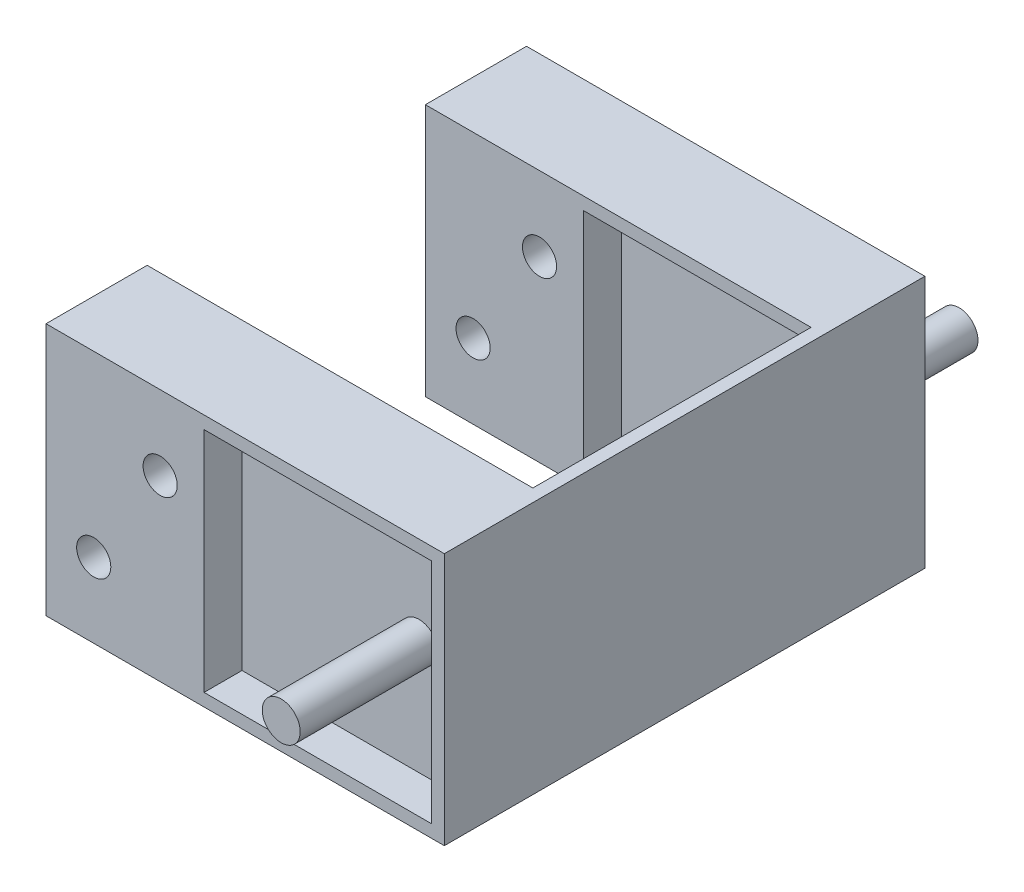
ISO-10303-21;
HEADER;
FILE_DESCRIPTION(('STEP AP214'),'2;1');
FILE_NAME('part.step','',(''),(''),'','','');
FILE_SCHEMA(('AUTOMOTIVE_DESIGN { 1 0 10303 214 1 1 1 1 }'));
ENDSEC;
DATA;
#1=APPLICATION_CONTEXT('core data for automotive mechanical design processes');
#2=APPLICATION_PROTOCOL_DEFINITION('international standard','automotive_design',2000,#1);
#3=PRODUCT_CONTEXT('',#1,'mechanical');
#4=PRODUCT('Part','Part','',(#3));
#5=PRODUCT_RELATED_PRODUCT_CATEGORY('part','',(#4));
#6=PRODUCT_DEFINITION_FORMATION('','',#4);
#7=PRODUCT_DEFINITION_CONTEXT('part definition',#1,'design');
#8=PRODUCT_DEFINITION('design','',#6,#7);
#9=PRODUCT_DEFINITION_SHAPE('','',#8);
#10=(LENGTH_UNIT() NAMED_UNIT(*) SI_UNIT(.MILLI.,.METRE.));
#11=(NAMED_UNIT(*) PLANE_ANGLE_UNIT() SI_UNIT($,.RADIAN.));
#12=(NAMED_UNIT(*) SI_UNIT($,.STERADIAN.) SOLID_ANGLE_UNIT());
#13=UNCERTAINTY_MEASURE_WITH_UNIT(LENGTH_MEASURE(1.E-05),#10,'distance_accuracy_value','');
#14=(GEOMETRIC_REPRESENTATION_CONTEXT(3) GLOBAL_UNCERTAINTY_ASSIGNED_CONTEXT((#13)) GLOBAL_UNIT_ASSIGNED_CONTEXT((#10,
#11,#12)) REPRESENTATION_CONTEXT('',''));
#15=CARTESIAN_POINT('',(0.,0.,0.));
#16=DIRECTION('',(0.,0.,1.));
#17=DIRECTION('',(1.,0.,0.));
#18=AXIS2_PLACEMENT_3D('',#15,#16,#17);
#19=CARTESIAN_POINT('',(0.,0.,0.));
#20=DIRECTION('',(0.,0.,1.));
#21=DIRECTION('',(1.,0.,0.));
#22=AXIS2_PLACEMENT_3D('',#19,#20,#21);
#23=PLANE('',#22);
#24=CARTESIAN_POINT('',(-5.50272441266284,14.1042617322285,0.));
#25=DIRECTION('',(0.,0.,1.));
#26=DIRECTION('',(1.,0.,0.));
#27=AXIS2_PLACEMENT_3D('',#24,#25,#26);
#28=CIRCLE('',#27,1.35);
#29=CARTESIAN_POINT('',(-4.15272441266284,14.1042617322285,0.));
#30=VERTEX_POINT('',#29);
#31=EDGE_CURVE('E340',#30,#30,#28,.T.);
#32=ORIENTED_EDGE('',*,*,#31,.T.);
#33=EDGE_LOOP('',(#32));
#34=FACE_BOUND('',#33,.T.);
#35=CARTESIAN_POINT('',(-10.7566747658956,5.89573826777152,0.));
#36=DIRECTION('',(0.,0.,1.));
#37=DIRECTION('',(1.,0.,0.));
#38=AXIS2_PLACEMENT_3D('',#35,#36,#37);
#39=CIRCLE('',#38,1.35);
#40=CARTESIAN_POINT('',(-9.40667476589562,5.89573826777152,0.));
#41=VERTEX_POINT('',#40);
#42=EDGE_CURVE('E341',#41,#41,#39,.T.);
#43=ORIENTED_EDGE('',*,*,#42,.T.);
#44=EDGE_LOOP('',(#43));
#45=FACE_BOUND('',#44,.T.);
#46=DIRECTION('',(0.,1.,0.));
#47=VECTOR('',#46,1.);
#48=CARTESIAN_POINT('',(15.969696969697,0.,0.));
#49=LINE('',#48,#47);
#50=CARTESIAN_POINT('',(15.969696969697,0.,0.));
#51=VERTEX_POINT('',#50);
#52=CARTESIAN_POINT('',(15.969696969697,1.,0.));
#53=VERTEX_POINT('',#52);
#54=EDGE_CURVE('E327',#51,#53,#49,.T.);
#55=ORIENTED_EDGE('',*,*,#54,.F.);
#56=DIRECTION('',(1.,0.,0.));
#57=VECTOR('',#56,1.);
#58=CARTESIAN_POINT('',(-14.530303030303,0.,0.));
#59=LINE('',#58,#57);
#60=CARTESIAN_POINT('',(-14.530303030303,0.,0.));
#61=VERTEX_POINT('',#60);
#62=EDGE_CURVE('E441',#61,#51,#59,.T.);
#63=ORIENTED_EDGE('',*,*,#62,.F.);
#64=DIRECTION('',(0.,-1.,0.));
#65=VECTOR('',#64,1.);
#66=CARTESIAN_POINT('',(-14.530303030303,20.,0.));
#67=LINE('',#66,#65);
#68=CARTESIAN_POINT('',(-14.530303030303,20.,0.));
#69=VERTEX_POINT('',#68);
#70=EDGE_CURVE('E422',#69,#61,#67,.T.);
#71=ORIENTED_EDGE('',*,*,#70,.F.);
#72=DIRECTION('',(-1.,0.,0.));
#73=VECTOR('',#72,1.);
#74=CARTESIAN_POINT('',(16.969696969697,20.,0.));
#75=LINE('',#74,#73);
#76=CARTESIAN_POINT('',(15.969696969697,20.,0.));
#77=VERTEX_POINT('',#76);
#78=EDGE_CURVE('E428',#77,#69,#75,.T.);
#79=ORIENTED_EDGE('',*,*,#78,.F.);
#80=CARTESIAN_POINT('',(15.969696969697,19.,0.));
#81=VERTEX_POINT('',#80);
#82=EDGE_CURVE('E332',#81,#77,#49,.T.);
#83=ORIENTED_EDGE('',*,*,#82,.F.);
#84=DIRECTION('',(-1.,0.,0.));
#85=VECTOR('',#84,1.);
#86=CARTESIAN_POINT('',(16.969696969697,19.,0.));
#87=LINE('',#86,#85);
#88=CARTESIAN_POINT('',(-2.03030303030303,19.,0.));
#89=VERTEX_POINT('',#88);
#90=EDGE_CURVE('E400',#81,#89,#87,.T.);
#91=ORIENTED_EDGE('',*,*,#90,.T.);
#92=DIRECTION('',(0.,1.,0.));
#93=VECTOR('',#92,1.);
#94=CARTESIAN_POINT('',(-2.03030303030303,20.,0.));
#95=LINE('',#94,#93);
#96=CARTESIAN_POINT('',(-2.03030303030303,1.,0.));
#97=VERTEX_POINT('',#96);
#98=EDGE_CURVE('E357',#97,#89,#95,.T.);
#99=ORIENTED_EDGE('',*,*,#98,.F.);
#100=DIRECTION('',(1.,0.,0.));
#101=VECTOR('',#100,1.);
#102=CARTESIAN_POINT('',(-14.530303030303,1.,0.));
#103=LINE('',#102,#101);
#104=EDGE_CURVE('E395',#97,#53,#103,.T.);
#105=ORIENTED_EDGE('',*,*,#104,.T.);
#106=EDGE_LOOP('',(#55,#63,#71,#79,#83,#91,#99,#105));
#107=FACE_BOUND('',#106,.T.);
#108=ADVANCED_FACE('F69',(#34,#45,#107),#23,.F.);
#109=CARTESIAN_POINT('',(-14.530303030303,1.,8.));
#110=DIRECTION('',(0.,1.,0.));
#111=DIRECTION('',(-1.,0.,0.));
#112=AXIS2_PLACEMENT_3D('',#109,#110,#111);
#113=PLANE('',#112);
#114=DIRECTION('',(0.,0.,-1.));
#115=VECTOR('',#114,1.);
#116=CARTESIAN_POINT('',(-2.03030303030303,1.,8.));
#117=LINE('',#116,#115);
#118=CARTESIAN_POINT('',(-2.03030303030303,1.,3.));
#119=VERTEX_POINT('',#118);
#120=EDGE_CURVE('E378',#119,#97,#117,.T.);
#121=ORIENTED_EDGE('',*,*,#120,.F.);
#122=DIRECTION('',(1.,0.,0.));
#123=VECTOR('',#122,1.);
#124=CARTESIAN_POINT('',(-14.530303030303,1.,3.));
#125=LINE('',#124,#123);
#126=CARTESIAN_POINT('',(15.969696969697,1.,3.));
#127=VERTEX_POINT('',#126);
#128=EDGE_CURVE('E385',#119,#127,#125,.T.);
#129=ORIENTED_EDGE('',*,*,#128,.T.);
#130=DIRECTION('',(0.,0.,-1.));
#131=VECTOR('',#130,1.);
#132=CARTESIAN_POINT('',(15.969696969697,1.,8.));
#133=LINE('',#132,#131);
#134=EDGE_CURVE('E417',#127,#53,#133,.T.);
#135=ORIENTED_EDGE('',*,*,#134,.T.);
#136=ORIENTED_EDGE('',*,*,#104,.F.);
#137=EDGE_LOOP('',(#121,#129,#135,#136));
#138=FACE_BOUND('',#137,.T.);
#139=ADVANCED_FACE('F572',(#138),#113,.T.);
#140=CARTESIAN_POINT('',(15.969696969697,0.,8.));
#141=DIRECTION('',(-1.,0.,0.));
#142=DIRECTION('',(0.,0.,1.));
#143=AXIS2_PLACEMENT_3D('',#140,#141,#142);
#144=PLANE('',#143);
#145=DIRECTION('',(0.,0.,-1.));
#146=VECTOR('',#145,1.);
#147=CARTESIAN_POINT('',(15.969696969697,19.,8.));
#148=LINE('',#147,#146);
#149=CARTESIAN_POINT('',(15.969696969697,19.,3.));
#150=VERTEX_POINT('',#149);
#151=EDGE_CURVE('E407',#150,#81,#148,.T.);
#152=ORIENTED_EDGE('',*,*,#151,.T.);
#153=ORIENTED_EDGE('',*,*,#82,.T.);
#154=DIRECTION('',(0.,0.,1.));
#155=VECTOR('',#154,1.);
#156=CARTESIAN_POINT('',(15.969696969697,20.,-22.));
#157=LINE('',#156,#155);
#158=CARTESIAN_POINT('',(15.969696969697,20.,-22.));
#159=VERTEX_POINT('',#158);
#160=EDGE_CURVE('E331',#159,#77,#157,.T.);
#161=ORIENTED_EDGE('',*,*,#160,.F.);
#162=DIRECTION('',(0.,1.,0.));
#163=VECTOR('',#162,1.);
#164=CARTESIAN_POINT('',(15.969696969697,0.,-22.));
#165=LINE('',#164,#163);
#166=CARTESIAN_POINT('',(15.969696969697,19.,-22.));
#167=VERTEX_POINT('',#166);
#168=EDGE_CURVE('E86',#167,#159,#165,.T.);
#169=ORIENTED_EDGE('',*,*,#168,.F.);
#170=DIRECTION('',(0.,0.,1.));
#171=VECTOR('',#170,1.);
#172=CARTESIAN_POINT('',(15.969696969697,19.,-30.));
#173=LINE('',#172,#171);
#174=CARTESIAN_POINT('',(15.969696969697,19.,-25.));
#175=VERTEX_POINT('',#174);
#176=EDGE_CURVE('E278',#175,#167,#173,.T.);
#177=ORIENTED_EDGE('',*,*,#176,.F.);
#178=DIRECTION('',(0.,1.,0.));
#179=VECTOR('',#178,1.);
#180=CARTESIAN_POINT('',(15.969696969697,0.,-25.));
#181=LINE('',#180,#179);
#182=CARTESIAN_POINT('',(15.969696969697,1.,-25.));
#183=VERTEX_POINT('',#182);
#184=EDGE_CURVE('E242',#183,#175,#181,.T.);
#185=ORIENTED_EDGE('',*,*,#184,.F.);
#186=DIRECTION('',(0.,0.,1.));
#187=VECTOR('',#186,1.);
#188=CARTESIAN_POINT('',(15.969696969697,1.,-30.));
#189=LINE('',#188,#187);
#190=CARTESIAN_POINT('',(15.969696969697,1.,-22.));
#191=VERTEX_POINT('',#190);
#192=EDGE_CURVE('E93',#183,#191,#189,.T.);
#193=ORIENTED_EDGE('',*,*,#192,.T.);
#194=CARTESIAN_POINT('',(15.969696969697,0.,-22.));
#195=VERTEX_POINT('',#194);
#196=EDGE_CURVE('E258',#195,#191,#165,.T.);
#197=ORIENTED_EDGE('',*,*,#196,.F.);
#198=DIRECTION('',(0.,0.,1.));
#199=VECTOR('',#198,1.);
#200=CARTESIAN_POINT('',(15.969696969697,0.,-22.));
#201=LINE('',#200,#199);
#202=EDGE_CURVE('E336',#195,#51,#201,.T.);
#203=ORIENTED_EDGE('',*,*,#202,.T.);
#204=ORIENTED_EDGE('',*,*,#54,.T.);
#205=ORIENTED_EDGE('',*,*,#134,.F.);
#206=DIRECTION('',(0.,1.,0.));
#207=VECTOR('',#206,1.);
#208=CARTESIAN_POINT('',(15.969696969697,0.,3.));
#209=LINE('',#208,#207);
#210=EDGE_CURVE('E381',#127,#150,#209,.T.);
#211=ORIENTED_EDGE('',*,*,#210,.T.);
#212=EDGE_LOOP('',(#152,#153,#161,#169,#177,#185,#193,#197,#203,#204,#205,#211));
#213=FACE_BOUND('',#212,.T.);
#214=ADVANCED_FACE('F578',(#213),#144,.T.);
#215=CARTESIAN_POINT('',(16.969696969697,19.,8.));
#216=DIRECTION('',(0.,-1.,0.));
#217=DIRECTION('',(1.,0.,0.));
#218=AXIS2_PLACEMENT_3D('',#215,#216,#217);
#219=PLANE('',#218);
#220=DIRECTION('',(0.,0.,1.));
#221=VECTOR('',#220,1.);
#222=CARTESIAN_POINT('',(-2.03030303030303,19.,8.));
#223=LINE('',#222,#221);
#224=CARTESIAN_POINT('',(-2.03030303030303,19.,3.));
#225=VERTEX_POINT('',#224);
#226=EDGE_CURVE('E375',#89,#225,#223,.T.);
#227=ORIENTED_EDGE('',*,*,#226,.F.);
#228=ORIENTED_EDGE('',*,*,#90,.F.);
#229=ORIENTED_EDGE('',*,*,#151,.F.);
#230=DIRECTION('',(-1.,0.,0.));
#231=VECTOR('',#230,1.);
#232=CARTESIAN_POINT('',(16.969696969697,19.,3.));
#233=LINE('',#232,#231);
#234=EDGE_CURVE('E459',#150,#225,#233,.T.);
#235=ORIENTED_EDGE('',*,*,#234,.T.);
#236=EDGE_LOOP('',(#227,#228,#229,#235));
#237=FACE_BOUND('',#236,.T.);
#238=ADVANCED_FACE('F619',(#237),#219,.T.);
#239=CARTESIAN_POINT('',(0.,0.,8.));
#240=DIRECTION('',(0.,0.,1.));
#241=DIRECTION('',(1.,0.,0.));
#242=AXIS2_PLACEMENT_3D('',#239,#240,#241);
#243=PLANE('',#242);
#244=CARTESIAN_POINT('',(-10.7566747658956,5.89573826777152,8.));
#245=DIRECTION('',(0.,0.,1.));
#246=DIRECTION('',(1.,0.,0.));
#247=AXIS2_PLACEMENT_3D('',#244,#245,#246);
#248=CIRCLE('',#247,1.35);
#249=CARTESIAN_POINT('',(-9.40667476589562,5.89573826777152,8.));
#250=VERTEX_POINT('',#249);
#251=EDGE_CURVE('E346',#250,#250,#248,.T.);
#252=ORIENTED_EDGE('',*,*,#251,.F.);
#253=EDGE_LOOP('',(#252));
#254=FACE_BOUND('',#253,.T.);
#255=CARTESIAN_POINT('',(-5.50272441266284,14.1042617322285,8.));
#256=DIRECTION('',(0.,0.,1.));
#257=DIRECTION('',(1.,0.,0.));
#258=AXIS2_PLACEMENT_3D('',#255,#256,#257);
#259=CIRCLE('',#258,1.35);
#260=CARTESIAN_POINT('',(-4.15272441266284,14.1042617322285,8.));
#261=VERTEX_POINT('',#260);
#262=EDGE_CURVE('E350',#261,#261,#259,.T.);
#263=ORIENTED_EDGE('',*,*,#262,.F.);
#264=EDGE_LOOP('',(#263));
#265=FACE_BOUND('',#264,.T.);
#266=DIRECTION('',(1.,0.,0.));
#267=VECTOR('',#266,1.);
#268=CARTESIAN_POINT('',(-14.530303030303,1.,8.));
#269=LINE('',#268,#267);
#270=CARTESIAN_POINT('',(-2.03030303030303,1.,8.));
#271=VERTEX_POINT('',#270);
#272=CARTESIAN_POINT('',(15.969696969697,1.,8.));
#273=VERTEX_POINT('',#272);
#274=EDGE_CURVE('E396',#271,#273,#269,.T.);
#275=ORIENTED_EDGE('',*,*,#274,.F.);
#276=DIRECTION('',(0.,1.,0.));
#277=VECTOR('',#276,1.);
#278=CARTESIAN_POINT('',(-2.03030303030303,20.,8.));
#279=LINE('',#278,#277);
#280=CARTESIAN_POINT('',(-2.03030303030303,19.,8.));
#281=VERTEX_POINT('',#280);
#282=EDGE_CURVE('E345',#271,#281,#279,.T.);
#283=ORIENTED_EDGE('',*,*,#282,.T.);
#284=DIRECTION('',(-1.,0.,0.));
#285=VECTOR('',#284,1.);
#286=CARTESIAN_POINT('',(16.969696969697,19.,8.));
#287=LINE('',#286,#285);
#288=CARTESIAN_POINT('',(15.969696969697,19.,8.));
#289=VERTEX_POINT('',#288);
#290=EDGE_CURVE('E404',#289,#281,#287,.T.);
#291=ORIENTED_EDGE('',*,*,#290,.F.);
#292=DIRECTION('',(0.,1.,0.));
#293=VECTOR('',#292,1.);
#294=CARTESIAN_POINT('',(15.969696969697,0.,8.));
#295=LINE('',#294,#293);
#296=EDGE_CURVE('E399',#273,#289,#295,.T.);
#297=ORIENTED_EDGE('',*,*,#296,.F.);
#298=EDGE_LOOP('',(#275,#283,#291,#297));
#299=FACE_BOUND('',#298,.T.);
#300=DIRECTION('',(1.,0.,0.));
#301=VECTOR('',#300,1.);
#302=CARTESIAN_POINT('',(-14.530303030303,0.,8.));
#303=LINE('',#302,#301);
#304=CARTESIAN_POINT('',(-14.530303030303,0.,8.));
#305=VERTEX_POINT('',#304);
#306=CARTESIAN_POINT('',(16.969696969697,0.,8.));
#307=VERTEX_POINT('',#306);
#308=EDGE_CURVE('E427',#305,#307,#303,.T.);
#309=ORIENTED_EDGE('',*,*,#308,.T.);
#310=DIRECTION('',(0.,1.,0.));
#311=VECTOR('',#310,1.);
#312=CARTESIAN_POINT('',(16.969696969697,0.,8.));
#313=LINE('',#312,#311);
#314=CARTESIAN_POINT('',(16.969696969697,20.,8.));
#315=VERTEX_POINT('',#314);
#316=EDGE_CURVE('E431',#307,#315,#313,.T.);
#317=ORIENTED_EDGE('',*,*,#316,.T.);
#318=DIRECTION('',(-1.,0.,0.));
#319=VECTOR('',#318,1.);
#320=CARTESIAN_POINT('',(16.969696969697,20.,8.));
#321=LINE('',#320,#319);
#322=CARTESIAN_POINT('',(-14.530303030303,20.,8.));
#323=VERTEX_POINT('',#322);
#324=EDGE_CURVE('E434',#315,#323,#321,.T.);
#325=ORIENTED_EDGE('',*,*,#324,.T.);
#326=DIRECTION('',(0.,-1.,0.));
#327=VECTOR('',#326,1.);
#328=CARTESIAN_POINT('',(-14.530303030303,20.,8.));
#329=LINE('',#328,#327);
#330=EDGE_CURVE('E423',#323,#305,#329,.T.);
#331=ORIENTED_EDGE('',*,*,#330,.T.);
#332=EDGE_LOOP('',(#309,#317,#325,#331));
#333=FACE_BOUND('',#332,.T.);
#334=ADVANCED_FACE('F585',(#254,#265,#299,#333),#243,.T.);
#335=CARTESIAN_POINT('',(-14.530303030303,20.,8.));
#336=DIRECTION('',(1.,0.,0.));
#337=DIRECTION('',(0.,1.,0.));
#338=AXIS2_PLACEMENT_3D('',#335,#336,#337);
#339=PLANE('',#338);
#340=DIRECTION('',(0.,0.,-1.));
#341=VECTOR('',#340,1.);
#342=CARTESIAN_POINT('',(-14.530303030303,20.,8.));
#343=LINE('',#342,#341);
#344=EDGE_CURVE('E437',#323,#69,#343,.T.);
#345=ORIENTED_EDGE('',*,*,#344,.T.);
#346=ORIENTED_EDGE('',*,*,#70,.T.);
#347=DIRECTION('',(0.,0.,-1.));
#348=VECTOR('',#347,1.);
#349=CARTESIAN_POINT('',(-14.530303030303,0.,8.));
#350=LINE('',#349,#348);
#351=EDGE_CURVE('E456',#305,#61,#350,.T.);
#352=ORIENTED_EDGE('',*,*,#351,.F.);
#353=ORIENTED_EDGE('',*,*,#330,.F.);
#354=EDGE_LOOP('',(#345,#346,#352,#353));
#355=FACE_BOUND('',#354,.T.);
#356=ADVANCED_FACE('F71',(#355),#339,.F.);
#357=CARTESIAN_POINT('',(-14.530303030303,0.,8.));
#358=DIRECTION('',(0.,1.,0.));
#359=DIRECTION('',(-1.,0.,0.));
#360=AXIS2_PLACEMENT_3D('',#357,#358,#359);
#361=PLANE('',#360);
#362=ORIENTED_EDGE('',*,*,#62,.T.);
#363=ORIENTED_EDGE('',*,*,#202,.F.);
#364=DIRECTION('',(1.,0.,0.));
#365=VECTOR('',#364,1.);
#366=CARTESIAN_POINT('',(-14.530303030303,0.,-22.));
#367=LINE('',#366,#365);
#368=CARTESIAN_POINT('',(-14.530303030303,0.,-22.));
#369=VERTEX_POINT('',#368);
#370=EDGE_CURVE('E305',#369,#195,#367,.T.);
#371=ORIENTED_EDGE('',*,*,#370,.F.);
#372=DIRECTION('',(0.,0.,1.));
#373=VECTOR('',#372,1.);
#374=CARTESIAN_POINT('',(-14.530303030303,0.,-30.));
#375=LINE('',#374,#373);
#376=CARTESIAN_POINT('',(-14.530303030303,0.,-30.));
#377=VERTEX_POINT('',#376);
#378=EDGE_CURVE('E313',#377,#369,#375,.T.);
#379=ORIENTED_EDGE('',*,*,#378,.F.);
#380=DIRECTION('',(1.,0.,0.));
#381=VECTOR('',#380,1.);
#382=CARTESIAN_POINT('',(-14.530303030303,0.,-30.));
#383=LINE('',#382,#381);
#384=CARTESIAN_POINT('',(16.969696969697,0.,-30.));
#385=VERTEX_POINT('',#384);
#386=EDGE_CURVE('E288',#377,#385,#383,.T.);
#387=ORIENTED_EDGE('',*,*,#386,.T.);
#388=DIRECTION('',(0.,0.,-1.));
#389=VECTOR('',#388,1.);
#390=CARTESIAN_POINT('',(16.969696969697,0.,8.));
#391=LINE('',#390,#389);
#392=EDGE_CURVE('E453',#307,#385,#391,.T.);
#393=ORIENTED_EDGE('',*,*,#392,.F.);
#394=ORIENTED_EDGE('',*,*,#308,.F.);
#395=ORIENTED_EDGE('',*,*,#351,.T.);
#396=EDGE_LOOP('',(#362,#363,#371,#379,#387,#393,#394,#395));
#397=FACE_BOUND('',#396,.T.);
#398=ADVANCED_FACE('F592',(#397),#361,.F.);
#399=CARTESIAN_POINT('',(16.969696969697,0.,8.));
#400=DIRECTION('',(-1.,0.,0.));
#401=DIRECTION('',(0.,0.,1.));
#402=AXIS2_PLACEMENT_3D('',#399,#400,#401);
#403=PLANE('',#402);
#404=ORIENTED_EDGE('',*,*,#392,.T.);
#405=DIRECTION('',(0.,1.,0.));
#406=VECTOR('',#405,1.);
#407=CARTESIAN_POINT('',(16.969696969697,0.,-30.));
#408=LINE('',#407,#406);
#409=CARTESIAN_POINT('',(16.969696969697,20.,-30.));
#410=VERTEX_POINT('',#409);
#411=EDGE_CURVE('E293',#385,#410,#408,.T.);
#412=ORIENTED_EDGE('',*,*,#411,.T.);
#413=DIRECTION('',(0.,0.,-1.));
#414=VECTOR('',#413,1.);
#415=CARTESIAN_POINT('',(16.969696969697,20.,8.));
#416=LINE('',#415,#414);
#417=EDGE_CURVE('E450',#315,#410,#416,.T.);
#418=ORIENTED_EDGE('',*,*,#417,.F.);
#419=ORIENTED_EDGE('',*,*,#316,.F.);
#420=EDGE_LOOP('',(#404,#412,#418,#419));
#421=FACE_BOUND('',#420,.T.);
#422=ADVANCED_FACE('F589',(#421),#403,.F.);
#423=CARTESIAN_POINT('',(16.969696969697,20.,8.));
#424=DIRECTION('',(0.,-1.,0.));
#425=DIRECTION('',(1.,0.,0.));
#426=AXIS2_PLACEMENT_3D('',#423,#424,#425);
#427=PLANE('',#426);
#428=ORIENTED_EDGE('',*,*,#417,.T.);
#429=DIRECTION('',(-1.,0.,0.));
#430=VECTOR('',#429,1.);
#431=CARTESIAN_POINT('',(16.969696969697,20.,-30.));
#432=LINE('',#431,#430);
#433=CARTESIAN_POINT('',(-14.530303030303,20.,-30.));
#434=VERTEX_POINT('',#433);
#435=EDGE_CURVE('E297',#410,#434,#432,.T.);
#436=ORIENTED_EDGE('',*,*,#435,.T.);
#437=DIRECTION('',(0.,0.,1.));
#438=VECTOR('',#437,1.);
#439=CARTESIAN_POINT('',(-14.530303030303,20.,-30.));
#440=LINE('',#439,#438);
#441=CARTESIAN_POINT('',(-14.530303030303,20.,-22.));
#442=VERTEX_POINT('',#441);
#443=EDGE_CURVE('E301',#434,#442,#440,.T.);
#444=ORIENTED_EDGE('',*,*,#443,.T.);
#445=DIRECTION('',(-1.,0.,0.));
#446=VECTOR('',#445,1.);
#447=CARTESIAN_POINT('',(16.969696969697,20.,-22.));
#448=LINE('',#447,#446);
#449=EDGE_CURVE('E289',#159,#442,#448,.T.);
#450=ORIENTED_EDGE('',*,*,#449,.F.);
#451=ORIENTED_EDGE('',*,*,#160,.T.);
#452=ORIENTED_EDGE('',*,*,#78,.T.);
#453=ORIENTED_EDGE('',*,*,#344,.F.);
#454=ORIENTED_EDGE('',*,*,#324,.F.);
#455=EDGE_LOOP('',(#428,#436,#444,#450,#451,#452,#453,#454));
#456=FACE_BOUND('',#455,.T.);
#457=ADVANCED_FACE('F586',(#456),#427,.F.);
#458=DIRECTION('',(0.,0.,-1.));
#459=VECTOR('',#458,1.);
#460=CARTESIAN_POINT('',(-2.03030303030303,1.,8.));
#461=LINE('',#460,#459);
#462=CARTESIAN_POINT('',(-2.03030303030303,1.,5.));
#463=VERTEX_POINT('',#462);
#464=EDGE_CURVE('E367',#271,#463,#461,.T.);
#465=ORIENTED_EDGE('',*,*,#464,.F.);
#466=ORIENTED_EDGE('',*,*,#274,.T.);
#467=CARTESIAN_POINT('',(15.969696969697,1.,5.));
#468=VERTEX_POINT('',#467);
#469=EDGE_CURVE('E418',#273,#468,#133,.T.);
#470=ORIENTED_EDGE('',*,*,#469,.T.);
#471=DIRECTION('',(1.,0.,0.));
#472=VECTOR('',#471,1.);
#473=CARTESIAN_POINT('',(-14.530303030303,1.,5.));
#474=LINE('',#473,#472);
#475=EDGE_CURVE('E392',#463,#468,#474,.T.);
#476=ORIENTED_EDGE('',*,*,#475,.F.);
#477=EDGE_LOOP('',(#465,#466,#470,#476));
#478=FACE_BOUND('',#477,.T.);
#479=ADVANCED_FACE('F581',(#478),#113,.T.);
#480=DIRECTION('',(0.,1.,0.));
#481=VECTOR('',#480,1.);
#482=CARTESIAN_POINT('',(15.969696969697,0.,5.));
#483=LINE('',#482,#481);
#484=CARTESIAN_POINT('',(15.969696969697,19.,5.));
#485=VERTEX_POINT('',#484);
#486=EDGE_CURVE('E388',#468,#485,#483,.T.);
#487=ORIENTED_EDGE('',*,*,#486,.F.);
#488=ORIENTED_EDGE('',*,*,#469,.F.);
#489=ORIENTED_EDGE('',*,*,#296,.T.);
#490=EDGE_CURVE('E413',#289,#485,#148,.T.);
#491=ORIENTED_EDGE('',*,*,#490,.T.);
#492=EDGE_LOOP('',(#487,#488,#489,#491));
#493=FACE_BOUND('',#492,.T.);
#494=ADVANCED_FACE('F672',(#493),#144,.T.);
#495=DIRECTION('',(0.,0.,1.));
#496=VECTOR('',#495,1.);
#497=CARTESIAN_POINT('',(-2.03030303030303,19.,8.));
#498=LINE('',#497,#496);
#499=CARTESIAN_POINT('',(-2.03030303030303,19.,5.));
#500=VERTEX_POINT('',#499);
#501=EDGE_CURVE('E360',#500,#281,#498,.T.);
#502=ORIENTED_EDGE('',*,*,#501,.F.);
#503=DIRECTION('',(-1.,0.,0.));
#504=VECTOR('',#503,1.);
#505=CARTESIAN_POINT('',(16.969696969697,19.,5.));
#506=LINE('',#505,#504);
#507=EDGE_CURVE('E463',#485,#500,#506,.T.);
#508=ORIENTED_EDGE('',*,*,#507,.F.);
#509=ORIENTED_EDGE('',*,*,#490,.F.);
#510=ORIENTED_EDGE('',*,*,#290,.T.);
#511=EDGE_LOOP('',(#502,#508,#509,#510));
#512=FACE_BOUND('',#511,.T.);
#513=ADVANCED_FACE('F669',(#512),#219,.T.);
#514=CARTESIAN_POINT('',(0.,0.,3.));
#515=DIRECTION('',(0.,0.,1.));
#516=DIRECTION('',(1.,0.,0.));
#517=AXIS2_PLACEMENT_3D('',#514,#515,#516);
#518=PLANE('',#517);
#519=CARTESIAN_POINT('',(11.969696969697,10.,3.));
#520=DIRECTION('',(0.,0.,1.));
#521=DIRECTION('',(1.,0.,0.));
#522=AXIS2_PLACEMENT_3D('',#519,#520,#521);
#523=CIRCLE('',#522,1.5);
#524=CARTESIAN_POINT('',(13.469696969697,10.,3.));
#525=VERTEX_POINT('',#524);
#526=EDGE_CURVE('E533',#525,#525,#523,.T.);
#527=ORIENTED_EDGE('',*,*,#526,.T.);
#528=EDGE_LOOP('',(#527));
#529=FACE_BOUND('',#528,.T.);
#530=ORIENTED_EDGE('',*,*,#128,.F.);
#531=DIRECTION('',(0.,1.,0.));
#532=VECTOR('',#531,1.);
#533=CARTESIAN_POINT('',(-2.03030303030303,0.,3.));
#534=LINE('',#533,#532);
#535=EDGE_CURVE('E371',#119,#225,#534,.T.);
#536=ORIENTED_EDGE('',*,*,#535,.T.);
#537=ORIENTED_EDGE('',*,*,#234,.F.);
#538=ORIENTED_EDGE('',*,*,#210,.F.);
#539=EDGE_LOOP('',(#530,#536,#537,#538));
#540=FACE_BOUND('',#539,.T.);
#541=ADVANCED_FACE('F665',(#529,#540),#518,.F.);
#542=CARTESIAN_POINT('',(0.,0.,5.));
#543=DIRECTION('',(0.,0.,1.));
#544=DIRECTION('',(1.,0.,0.));
#545=AXIS2_PLACEMENT_3D('',#542,#543,#544);
#546=PLANE('',#545);
#547=CARTESIAN_POINT('',(11.969696969697,10.,5.));
#548=DIRECTION('',(0.,0.,1.));
#549=DIRECTION('',(1.,0.,0.));
#550=AXIS2_PLACEMENT_3D('',#547,#548,#549);
#551=CIRCLE('',#550,1.5);
#552=CARTESIAN_POINT('',(13.469696969697,10.,5.));
#553=VERTEX_POINT('',#552);
#554=EDGE_CURVE('E12',#553,#553,#551,.T.);
#555=ORIENTED_EDGE('',*,*,#554,.F.);
#556=EDGE_LOOP('',(#555));
#557=FACE_BOUND('',#556,.T.);
#558=DIRECTION('',(0.,1.,0.));
#559=VECTOR('',#558,1.);
#560=CARTESIAN_POINT('',(-2.03030303030303,0.,5.));
#561=LINE('',#560,#559);
#562=EDGE_CURVE('E465',#463,#500,#561,.T.);
#563=ORIENTED_EDGE('',*,*,#562,.F.);
#564=ORIENTED_EDGE('',*,*,#475,.T.);
#565=ORIENTED_EDGE('',*,*,#486,.T.);
#566=ORIENTED_EDGE('',*,*,#507,.T.);
#567=EDGE_LOOP('',(#563,#564,#565,#566));
#568=FACE_BOUND('',#567,.T.);
#569=ADVANCED_FACE('F662',(#557,#568),#546,.T.);
#570=CARTESIAN_POINT('',(-2.03030303030303,20.,0.));
#571=DIRECTION('',(1.,0.,0.));
#572=DIRECTION('',(0.,1.,0.));
#573=AXIS2_PLACEMENT_3D('',#570,#571,#572);
#574=PLANE('',#573);
#575=ORIENTED_EDGE('',*,*,#282,.F.);
#576=ORIENTED_EDGE('',*,*,#464,.T.);
#577=ORIENTED_EDGE('',*,*,#562,.T.);
#578=ORIENTED_EDGE('',*,*,#501,.T.);
#579=EDGE_LOOP('',(#575,#576,#577,#578));
#580=FACE_BOUND('',#579,.T.);
#581=ADVANCED_FACE('F659',(#580),#574,.T.);
#582=ORIENTED_EDGE('',*,*,#535,.F.);
#583=ORIENTED_EDGE('',*,*,#120,.T.);
#584=ORIENTED_EDGE('',*,*,#98,.T.);
#585=ORIENTED_EDGE('',*,*,#226,.T.);
#586=EDGE_LOOP('',(#582,#583,#584,#585));
#587=FACE_BOUND('',#586,.T.);
#588=ADVANCED_FACE('F657',(#587),#574,.T.);
#589=CARTESIAN_POINT('',(-5.50272441266284,14.1042617322285,0.));
#590=DIRECTION('',(0.,0.,1.));
#591=DIRECTION('',(1.,0.,0.));
#592=AXIS2_PLACEMENT_3D('',#589,#590,#591);
#593=CYLINDRICAL_SURFACE('',#592,1.35);
#594=ORIENTED_EDGE('',*,*,#31,.F.);
#595=EDGE_LOOP('',(#594));
#596=FACE_BOUND('',#595,.T.);
#597=ORIENTED_EDGE('',*,*,#262,.T.);
#598=EDGE_LOOP('',(#597));
#599=FACE_BOUND('',#598,.T.);
#600=ADVANCED_FACE('F653',(#596,#599),#593,.F.);
#601=CARTESIAN_POINT('',(-10.7566747658956,5.89573826777152,0.));
#602=DIRECTION('',(0.,0.,1.));
#603=DIRECTION('',(1.,0.,0.));
#604=AXIS2_PLACEMENT_3D('',#601,#602,#603);
#605=CYLINDRICAL_SURFACE('',#604,1.35);
#606=ORIENTED_EDGE('',*,*,#42,.F.);
#607=EDGE_LOOP('',(#606));
#608=FACE_BOUND('',#607,.T.);
#609=ORIENTED_EDGE('',*,*,#251,.T.);
#610=EDGE_LOOP('',(#609));
#611=FACE_BOUND('',#610,.T.);
#612=ADVANCED_FACE('F650',(#608,#611),#605,.F.);
#613=CARTESIAN_POINT('',(0.,0.,-22.));
#614=DIRECTION('',(0.,0.,-1.));
#615=DIRECTION('',(1.,0.,0.));
#616=AXIS2_PLACEMENT_3D('',#613,#614,#615);
#617=PLANE('',#616);
#618=CARTESIAN_POINT('',(-5.50272441266284,14.1042617322285,-22.));
#619=DIRECTION('',(0.,0.,1.));
#620=DIRECTION('',(1.,0.,0.));
#621=AXIS2_PLACEMENT_3D('',#618,#619,#620);
#622=CIRCLE('',#621,1.35);
#623=CARTESIAN_POINT('',(-4.15272441266284,14.1042617322285,-22.));
#624=VERTEX_POINT('',#623);
#625=EDGE_CURVE('E532',#624,#624,#622,.T.);
#626=ORIENTED_EDGE('',*,*,#625,.F.);
#627=EDGE_LOOP('',(#626));
#628=FACE_BOUND('',#627,.T.);
#629=CARTESIAN_POINT('',(-10.7566747658956,5.89573826777152,-22.));
#630=DIRECTION('',(0.,0.,1.));
#631=DIRECTION('',(1.,0.,0.));
#632=AXIS2_PLACEMENT_3D('',#629,#630,#631);
#633=CIRCLE('',#632,1.35);
#634=CARTESIAN_POINT('',(-9.40667476589562,5.89573826777152,-22.));
#635=VERTEX_POINT('',#634);
#636=EDGE_CURVE('E1150',#635,#635,#633,.T.);
#637=ORIENTED_EDGE('',*,*,#636,.F.);
#638=EDGE_LOOP('',(#637));
#639=FACE_BOUND('',#638,.T.);
#640=ORIENTED_EDGE('',*,*,#196,.T.);
#641=DIRECTION('',(1.,0.,0.));
#642=VECTOR('',#641,1.);
#643=CARTESIAN_POINT('',(-14.530303030303,1.,-22.));
#644=LINE('',#643,#642);
#645=CARTESIAN_POINT('',(-2.03030303030303,1.,-22.));
#646=VERTEX_POINT('',#645);
#647=EDGE_CURVE('E236',#646,#191,#644,.T.);
#648=ORIENTED_EDGE('',*,*,#647,.F.);
#649=DIRECTION('',(0.,1.,0.));
#650=VECTOR('',#649,1.);
#651=CARTESIAN_POINT('',(-2.03030303030303,20.,-22.));
#652=LINE('',#651,#650);
#653=CARTESIAN_POINT('',(-2.03030303030303,19.,-22.));
#654=VERTEX_POINT('',#653);
#655=EDGE_CURVE('E246',#646,#654,#652,.T.);
#656=ORIENTED_EDGE('',*,*,#655,.T.);
#657=DIRECTION('',(-1.,0.,0.));
#658=VECTOR('',#657,1.);
#659=CARTESIAN_POINT('',(16.969696969697,19.,-22.));
#660=LINE('',#659,#658);
#661=EDGE_CURVE('E260',#167,#654,#660,.T.);
#662=ORIENTED_EDGE('',*,*,#661,.F.);
#663=ORIENTED_EDGE('',*,*,#168,.T.);
#664=ORIENTED_EDGE('',*,*,#449,.T.);
#665=DIRECTION('',(0.,-1.,0.));
#666=VECTOR('',#665,1.);
#667=CARTESIAN_POINT('',(-14.530303030303,20.,-22.));
#668=LINE('',#667,#666);
#669=EDGE_CURVE('E283',#442,#369,#668,.T.);
#670=ORIENTED_EDGE('',*,*,#669,.T.);
#671=ORIENTED_EDGE('',*,*,#370,.T.);
#672=EDGE_LOOP('',(#640,#648,#656,#662,#663,#664,#670,#671));
#673=FACE_BOUND('',#672,.T.);
#674=ADVANCED_FACE('F256',(#628,#639,#673),#617,.F.);
#675=CARTESIAN_POINT('',(-14.530303030303,1.,-30.));
#676=DIRECTION('',(0.,1.,0.));
#677=DIRECTION('',(-1.,0.,0.));
#678=AXIS2_PLACEMENT_3D('',#675,#676,#677);
#679=PLANE('',#678);
#680=DIRECTION('',(0.,0.,1.));
#681=VECTOR('',#680,1.);
#682=CARTESIAN_POINT('',(-2.03030303030303,1.,-30.));
#683=LINE('',#682,#681);
#684=CARTESIAN_POINT('',(-2.03030303030303,1.,-25.));
#685=VERTEX_POINT('',#684);
#686=EDGE_CURVE('E232',#685,#646,#683,.T.);
#687=ORIENTED_EDGE('',*,*,#686,.T.);
#688=ORIENTED_EDGE('',*,*,#647,.T.);
#689=ORIENTED_EDGE('',*,*,#192,.F.);
#690=DIRECTION('',(1.,0.,0.));
#691=VECTOR('',#690,1.);
#692=CARTESIAN_POINT('',(-14.530303030303,1.,-25.));
#693=LINE('',#692,#691);
#694=EDGE_CURVE('E239',#685,#183,#693,.T.);
#695=ORIENTED_EDGE('',*,*,#694,.F.);
#696=EDGE_LOOP('',(#687,#688,#689,#695));
#697=FACE_BOUND('',#696,.T.);
#698=ADVANCED_FACE('F234',(#697),#679,.T.);
#699=CARTESIAN_POINT('',(16.969696969697,19.,-30.));
#700=DIRECTION('',(0.,-1.,0.));
#701=DIRECTION('',(1.,0.,0.));
#702=AXIS2_PLACEMENT_3D('',#699,#700,#701);
#703=PLANE('',#702);
#704=DIRECTION('',(0.,0.,-1.));
#705=VECTOR('',#704,1.);
#706=CARTESIAN_POINT('',(-2.03030303030303,19.,-30.));
#707=LINE('',#706,#705);
#708=CARTESIAN_POINT('',(-2.03030303030303,19.,-25.));
#709=VERTEX_POINT('',#708);
#710=EDGE_CURVE('E243',#654,#709,#707,.T.);
#711=ORIENTED_EDGE('',*,*,#710,.T.);
#712=DIRECTION('',(-1.,0.,0.));
#713=VECTOR('',#712,1.);
#714=CARTESIAN_POINT('',(16.969696969697,19.,-25.));
#715=LINE('',#714,#713);
#716=EDGE_CURVE('E316',#175,#709,#715,.T.);
#717=ORIENTED_EDGE('',*,*,#716,.F.);
#718=ORIENTED_EDGE('',*,*,#176,.T.);
#719=ORIENTED_EDGE('',*,*,#661,.T.);
#720=EDGE_LOOP('',(#711,#717,#718,#719));
#721=FACE_BOUND('',#720,.T.);
#722=ADVANCED_FACE('F525',(#721),#703,.T.);
#723=CARTESIAN_POINT('',(0.,0.,-30.));
#724=DIRECTION('',(0.,0.,-1.));
#725=DIRECTION('',(1.,0.,0.));
#726=AXIS2_PLACEMENT_3D('',#723,#724,#725);
#727=PLANE('',#726);
#728=CARTESIAN_POINT('',(-10.7566747658956,5.89573826777152,-30.));
#729=DIRECTION('',(0.,0.,1.));
#730=DIRECTION('',(1.,0.,0.));
#731=AXIS2_PLACEMENT_3D('',#728,#729,#730);
#732=CIRCLE('',#731,1.35);
#733=CARTESIAN_POINT('',(-9.40667476589562,5.89573826777152,-30.));
#734=VERTEX_POINT('',#733);
#735=EDGE_CURVE('E1146',#734,#734,#732,.T.);
#736=ORIENTED_EDGE('',*,*,#735,.T.);
#737=EDGE_LOOP('',(#736));
#738=FACE_BOUND('',#737,.T.);
#739=CARTESIAN_POINT('',(-5.50272441266284,14.1042617322285,-30.));
#740=DIRECTION('',(0.,0.,1.));
#741=DIRECTION('',(1.,0.,0.));
#742=AXIS2_PLACEMENT_3D('',#739,#740,#741);
#743=CIRCLE('',#742,1.35);
#744=CARTESIAN_POINT('',(-4.15272441266284,14.1042617322285,-30.));
#745=VERTEX_POINT('',#744);
#746=EDGE_CURVE('E537',#745,#745,#743,.T.);
#747=ORIENTED_EDGE('',*,*,#746,.T.);
#748=EDGE_LOOP('',(#747));
#749=FACE_BOUND('',#748,.T.);
#750=DIRECTION('',(1.,0.,0.));
#751=VECTOR('',#750,1.);
#752=CARTESIAN_POINT('',(-14.530303030303,1.,-30.));
#753=LINE('',#752,#751);
#754=CARTESIAN_POINT('',(-2.03030303030303,1.,-30.));
#755=VERTEX_POINT('',#754);
#756=CARTESIAN_POINT('',(15.969696969697,1.,-30.));
#757=VERTEX_POINT('',#756);
#758=EDGE_CURVE('E265',#755,#757,#753,.T.);
#759=ORIENTED_EDGE('',*,*,#758,.T.);
#760=DIRECTION('',(0.,1.,0.));
#761=VECTOR('',#760,1.);
#762=CARTESIAN_POINT('',(15.969696969697,0.,-30.));
#763=LINE('',#762,#761);
#764=CARTESIAN_POINT('',(15.969696969697,19.,-30.));
#765=VERTEX_POINT('',#764);
#766=EDGE_CURVE('E517',#757,#765,#763,.T.);
#767=ORIENTED_EDGE('',*,*,#766,.T.);
#768=DIRECTION('',(-1.,0.,0.));
#769=VECTOR('',#768,1.);
#770=CARTESIAN_POINT('',(16.969696969697,19.,-30.));
#771=LINE('',#770,#769);
#772=CARTESIAN_POINT('',(-2.03030303030303,19.,-30.));
#773=VERTEX_POINT('',#772);
#774=EDGE_CURVE('E271',#765,#773,#771,.T.);
#775=ORIENTED_EDGE('',*,*,#774,.T.);
#776=DIRECTION('',(0.,1.,0.));
#777=VECTOR('',#776,1.);
#778=CARTESIAN_POINT('',(-2.03030303030303,20.,-30.));
#779=LINE('',#778,#777);
#780=EDGE_CURVE('E254',#755,#773,#779,.T.);
#781=ORIENTED_EDGE('',*,*,#780,.F.);
#782=EDGE_LOOP('',(#759,#767,#775,#781));
#783=FACE_BOUND('',#782,.T.);
#784=ORIENTED_EDGE('',*,*,#386,.F.);
#785=DIRECTION('',(0.,-1.,0.));
#786=VECTOR('',#785,1.);
#787=CARTESIAN_POINT('',(-14.530303030303,20.,-30.));
#788=LINE('',#787,#786);
#789=EDGE_CURVE('E284',#434,#377,#788,.T.);
#790=ORIENTED_EDGE('',*,*,#789,.F.);
#791=ORIENTED_EDGE('',*,*,#435,.F.);
#792=ORIENTED_EDGE('',*,*,#411,.F.);
#793=EDGE_LOOP('',(#784,#790,#791,#792));
#794=FACE_BOUND('',#793,.T.);
#795=ADVANCED_FACE('F632',(#738,#749,#783,#794),#727,.T.);
#796=CARTESIAN_POINT('',(-14.530303030303,20.,-30.));
#797=DIRECTION('',(1.,0.,0.));
#798=DIRECTION('',(0.,1.,0.));
#799=AXIS2_PLACEMENT_3D('',#796,#797,#798);
#800=PLANE('',#799);
#801=ORIENTED_EDGE('',*,*,#443,.F.);
#802=ORIENTED_EDGE('',*,*,#789,.T.);
#803=ORIENTED_EDGE('',*,*,#378,.T.);
#804=ORIENTED_EDGE('',*,*,#669,.F.);
#805=EDGE_LOOP('',(#801,#802,#803,#804));
#806=FACE_BOUND('',#805,.T.);
#807=ADVANCED_FACE('F634',(#806),#800,.F.);
#808=DIRECTION('',(0.,0.,1.));
#809=VECTOR('',#808,1.);
#810=CARTESIAN_POINT('',(-2.03030303030303,1.,-30.));
#811=LINE('',#810,#809);
#812=CARTESIAN_POINT('',(-2.03030303030303,1.,-27.));
#813=VERTEX_POINT('',#812);
#814=EDGE_CURVE('E497',#755,#813,#811,.T.);
#815=ORIENTED_EDGE('',*,*,#814,.T.);
#816=DIRECTION('',(1.,0.,0.));
#817=VECTOR('',#816,1.);
#818=CARTESIAN_POINT('',(-14.530303030303,1.,-27.));
#819=LINE('',#818,#817);
#820=CARTESIAN_POINT('',(15.969696969697,1.,-27.));
#821=VERTEX_POINT('',#820);
#822=EDGE_CURVE('E261',#813,#821,#819,.T.);
#823=ORIENTED_EDGE('',*,*,#822,.T.);
#824=EDGE_CURVE('E279',#757,#821,#189,.T.);
#825=ORIENTED_EDGE('',*,*,#824,.F.);
#826=ORIENTED_EDGE('',*,*,#758,.F.);
#827=EDGE_LOOP('',(#815,#823,#825,#826));
#828=FACE_BOUND('',#827,.T.);
#829=ADVANCED_FACE('F637',(#828),#679,.T.);
#830=CARTESIAN_POINT('',(15.969696969697,0.,-30.));
#831=DIRECTION('',(-1.,0.,0.));
#832=DIRECTION('',(0.,0.,-1.));
#833=AXIS2_PLACEMENT_3D('',#830,#831,#832);
#834=PLANE('',#833);
#835=DIRECTION('',(0.,1.,0.));
#836=VECTOR('',#835,1.);
#837=CARTESIAN_POINT('',(15.969696969697,0.,-27.));
#838=LINE('',#837,#836);
#839=CARTESIAN_POINT('',(15.969696969697,19.,-27.));
#840=VERTEX_POINT('',#839);
#841=EDGE_CURVE('E268',#821,#840,#838,.T.);
#842=ORIENTED_EDGE('',*,*,#841,.T.);
#843=EDGE_CURVE('E274',#765,#840,#173,.T.);
#844=ORIENTED_EDGE('',*,*,#843,.F.);
#845=ORIENTED_EDGE('',*,*,#766,.F.);
#846=ORIENTED_EDGE('',*,*,#824,.T.);
#847=EDGE_LOOP('',(#842,#844,#845,#846));
#848=FACE_BOUND('',#847,.T.);
#849=ADVANCED_FACE('F643',(#848),#834,.T.);
#850=DIRECTION('',(0.,0.,-1.));
#851=VECTOR('',#850,1.);
#852=CARTESIAN_POINT('',(-2.03030303030303,19.,-30.));
#853=LINE('',#852,#851);
#854=CARTESIAN_POINT('',(-2.03030303030303,19.,-27.));
#855=VERTEX_POINT('',#854);
#856=EDGE_CURVE('E253',#855,#773,#853,.T.);
#857=ORIENTED_EDGE('',*,*,#856,.T.);
#858=ORIENTED_EDGE('',*,*,#774,.F.);
#859=ORIENTED_EDGE('',*,*,#843,.T.);
#860=DIRECTION('',(-1.,0.,0.));
#861=VECTOR('',#860,1.);
#862=CARTESIAN_POINT('',(16.969696969697,19.,-27.));
#863=LINE('',#862,#861);
#864=EDGE_CURVE('E320',#840,#855,#863,.T.);
#865=ORIENTED_EDGE('',*,*,#864,.T.);
#866=EDGE_LOOP('',(#857,#858,#859,#865));
#867=FACE_BOUND('',#866,.T.);
#868=ADVANCED_FACE('F490',(#867),#703,.T.);
#869=CARTESIAN_POINT('',(0.,0.,-25.));
#870=DIRECTION('',(0.,0.,-1.));
#871=DIRECTION('',(1.,0.,0.));
#872=AXIS2_PLACEMENT_3D('',#869,#870,#871);
#873=PLANE('',#872);
#874=CARTESIAN_POINT('',(11.969696969697,10.,-25.));
#875=DIRECTION('',(0.,0.,-1.));
#876=DIRECTION('',(-1.,0.,0.));
#877=AXIS2_PLACEMENT_3D('',#874,#875,#876);
#878=CIRCLE('',#877,1.5);
#879=CARTESIAN_POINT('',(10.469696969697,10.,-25.));
#880=VERTEX_POINT('',#879);
#881=EDGE_CURVE('E540',#880,#880,#878,.T.);
#882=ORIENTED_EDGE('',*,*,#881,.T.);
#883=EDGE_LOOP('',(#882));
#884=FACE_BOUND('',#883,.T.);
#885=ORIENTED_EDGE('',*,*,#694,.T.);
#886=ORIENTED_EDGE('',*,*,#184,.T.);
#887=ORIENTED_EDGE('',*,*,#716,.T.);
#888=DIRECTION('',(0.,1.,0.));
#889=VECTOR('',#888,1.);
#890=CARTESIAN_POINT('',(-2.03030303030303,0.,-25.));
#891=LINE('',#890,#889);
#892=EDGE_CURVE('E500',#685,#709,#891,.T.);
#893=ORIENTED_EDGE('',*,*,#892,.F.);
#894=EDGE_LOOP('',(#885,#886,#887,#893));
#895=FACE_BOUND('',#894,.T.);
#896=ADVANCED_FACE('F483',(#884,#895),#873,.F.);
#897=CARTESIAN_POINT('',(0.,0.,-27.));
#898=DIRECTION('',(0.,0.,-1.));
#899=DIRECTION('',(1.,0.,0.));
#900=AXIS2_PLACEMENT_3D('',#897,#898,#899);
#901=PLANE('',#900);
#902=CARTESIAN_POINT('',(11.969696969697,10.,-27.));
#903=DIRECTION('',(0.,0.,-1.));
#904=DIRECTION('',(-1.,0.,0.));
#905=AXIS2_PLACEMENT_3D('',#902,#903,#904);
#906=CIRCLE('',#905,1.5);
#907=CARTESIAN_POINT('',(10.469696969697,10.,-27.));
#908=VERTEX_POINT('',#907);
#909=EDGE_CURVE('E73',#908,#908,#906,.T.);
#910=ORIENTED_EDGE('',*,*,#909,.F.);
#911=EDGE_LOOP('',(#910));
#912=FACE_BOUND('',#911,.T.);
#913=DIRECTION('',(0.,1.,0.));
#914=VECTOR('',#913,1.);
#915=CARTESIAN_POINT('',(-2.03030303030303,0.,-27.));
#916=LINE('',#915,#914);
#917=EDGE_CURVE('E324',#813,#855,#916,.T.);
#918=ORIENTED_EDGE('',*,*,#917,.T.);
#919=ORIENTED_EDGE('',*,*,#864,.F.);
#920=ORIENTED_EDGE('',*,*,#841,.F.);
#921=ORIENTED_EDGE('',*,*,#822,.F.);
#922=EDGE_LOOP('',(#918,#919,#920,#921));
#923=FACE_BOUND('',#922,.T.);
#924=ADVANCED_FACE('F479',(#912,#923),#901,.T.);
#925=CARTESIAN_POINT('',(-2.03030303030303,20.,-22.));
#926=DIRECTION('',(1.,0.,0.));
#927=DIRECTION('',(0.,1.,0.));
#928=AXIS2_PLACEMENT_3D('',#925,#926,#927);
#929=PLANE('',#928);
#930=ORIENTED_EDGE('',*,*,#780,.T.);
#931=ORIENTED_EDGE('',*,*,#856,.F.);
#932=ORIENTED_EDGE('',*,*,#917,.F.);
#933=ORIENTED_EDGE('',*,*,#814,.F.);
#934=EDGE_LOOP('',(#930,#931,#932,#933));
#935=FACE_BOUND('',#934,.T.);
#936=ADVANCED_FACE('F482',(#935),#929,.T.);
#937=ORIENTED_EDGE('',*,*,#892,.T.);
#938=ORIENTED_EDGE('',*,*,#710,.F.);
#939=ORIENTED_EDGE('',*,*,#655,.F.);
#940=ORIENTED_EDGE('',*,*,#686,.F.);
#941=EDGE_LOOP('',(#937,#938,#939,#940));
#942=FACE_BOUND('',#941,.T.);
#943=ADVANCED_FACE('F247',(#942),#929,.T.);
#944=CARTESIAN_POINT('',(-5.50272441266284,14.1042617322285,-22.));
#945=DIRECTION('',(0.,0.,-1.));
#946=DIRECTION('',(1.,0.,0.));
#947=AXIS2_PLACEMENT_3D('',#944,#945,#946);
#948=CYLINDRICAL_SURFACE('',#947,1.35);
#949=ORIENTED_EDGE('',*,*,#625,.T.);
#950=EDGE_LOOP('',(#949));
#951=FACE_BOUND('',#950,.T.);
#952=ORIENTED_EDGE('',*,*,#746,.F.);
#953=EDGE_LOOP('',(#952));
#954=FACE_BOUND('',#953,.T.);
#955=ADVANCED_FACE('F567',(#951,#954),#948,.F.);
#956=CARTESIAN_POINT('',(-10.7566747658956,5.89573826777152,-22.));
#957=DIRECTION('',(0.,0.,-1.));
#958=DIRECTION('',(1.,0.,0.));
#959=AXIS2_PLACEMENT_3D('',#956,#957,#958);
#960=CYLINDRICAL_SURFACE('',#959,1.35);
#961=ORIENTED_EDGE('',*,*,#636,.T.);
#962=EDGE_LOOP('',(#961));
#963=FACE_BOUND('',#962,.T.);
#964=ORIENTED_EDGE('',*,*,#735,.F.);
#965=EDGE_LOOP('',(#964));
#966=FACE_BOUND('',#965,.T.);
#967=ADVANCED_FACE('F558',(#963,#966),#960,.F.);
#968=CARTESIAN_POINT('',(11.969696969697,10.,-37.7));
#969=DIRECTION('',(0.,0.,1.));
#970=DIRECTION('',(1.,0.,0.));
#971=AXIS2_PLACEMENT_3D('',#968,#969,#970);
#972=PLANE('',#971);
#973=CARTESIAN_POINT('',(11.969696969697,10.,-37.7));
#974=DIRECTION('',(0.,0.,1.));
#975=DIRECTION('',(1.,0.,0.));
#976=AXIS2_PLACEMENT_3D('',#973,#974,#975);
#977=CIRCLE('',#976,1.5);
#978=CARTESIAN_POINT('',(13.469696969697,10.,-37.7));
#979=VERTEX_POINT('',#978);
#980=EDGE_CURVE('E545',#979,#979,#977,.T.);
#981=ORIENTED_EDGE('',*,*,#980,.F.);
#982=EDGE_LOOP('',(#981));
#983=FACE_BOUND('',#982,.T.);
#984=ADVANCED_FACE('F556',(#983),#972,.F.);
#985=CARTESIAN_POINT('',(11.969696969697,10.,-37.7));
#986=DIRECTION('',(0.,0.,1.));
#987=DIRECTION('',(1.,0.,0.));
#988=AXIS2_PLACEMENT_3D('',#985,#986,#987);
#989=CYLINDRICAL_SURFACE('',#988,1.5);
#990=ORIENTED_EDGE('',*,*,#909,.T.);
#991=EDGE_LOOP('',(#990));
#992=FACE_BOUND('',#991,.T.);
#993=ORIENTED_EDGE('',*,*,#980,.T.);
#994=EDGE_LOOP('',(#993));
#995=FACE_BOUND('',#994,.T.);
#996=ADVANCED_FACE('F476',(#992,#995),#989,.T.);
#997=ORIENTED_EDGE('',*,*,#881,.F.);
#998=EDGE_LOOP('',(#997));
#999=FACE_BOUND('',#998,.T.);
#1000=ORIENTED_EDGE('',*,*,#526,.F.);
#1001=EDGE_LOOP('',(#1000));
#1002=FACE_BOUND('',#1001,.T.);
#1003=ADVANCED_FACE('F564',(#999,#1002),#989,.T.);
#1004=ORIENTED_EDGE('',*,*,#554,.T.);
#1005=EDGE_LOOP('',(#1004));
#1006=FACE_BOUND('',#1005,.T.);
#1007=CARTESIAN_POINT('',(11.969696969697,10.,15.9));
#1008=DIRECTION('',(0.,0.,1.));
#1009=DIRECTION('',(1.,0.,0.));
#1010=AXIS2_PLACEMENT_3D('',#1007,#1008,#1009);
#1011=CIRCLE('',#1010,1.5);
#1012=CARTESIAN_POINT('',(13.469696969697,10.,15.9));
#1013=VERTEX_POINT('',#1012);
#1014=EDGE_CURVE('E548',#1013,#1013,#1011,.T.);
#1015=ORIENTED_EDGE('',*,*,#1014,.F.);
#1016=EDGE_LOOP('',(#1015));
#1017=FACE_BOUND('',#1016,.T.);
#1018=ADVANCED_FACE('F566',(#1006,#1017),#989,.T.);
#1019=CARTESIAN_POINT('',(11.969696969697,10.,15.9));
#1020=DIRECTION('',(0.,0.,1.));
#1021=DIRECTION('',(1.,0.,0.));
#1022=AXIS2_PLACEMENT_3D('',#1019,#1020,#1021);
#1023=PLANE('',#1022);
#1024=ORIENTED_EDGE('',*,*,#1014,.T.);
#1025=EDGE_LOOP('',(#1024));
#1026=FACE_BOUND('',#1025,.T.);
#1027=ADVANCED_FACE('F923',(#1026),#1023,.T.);
#1028=CLOSED_SHELL('',(#108,#139,#214,#238,#334,#356,#398,#422,#457,#479,#494,#513,#541,#569,
#581,#588,#600,#612,#674,#698,#722,#795,#807,#829,#849,#868,#896,#924,#936,#943,#955,#967,#984,
#996,#1003,#1018,#1027));
#1029=MANIFOLD_SOLID_BREP('B2',#1028);
#1030=ADVANCED_BREP_SHAPE_REPRESENTATION('',(#18,#1029),#14);
#1031=SHAPE_DEFINITION_REPRESENTATION(#9,#1030);
ENDSEC;
END-ISO-10303-21;
